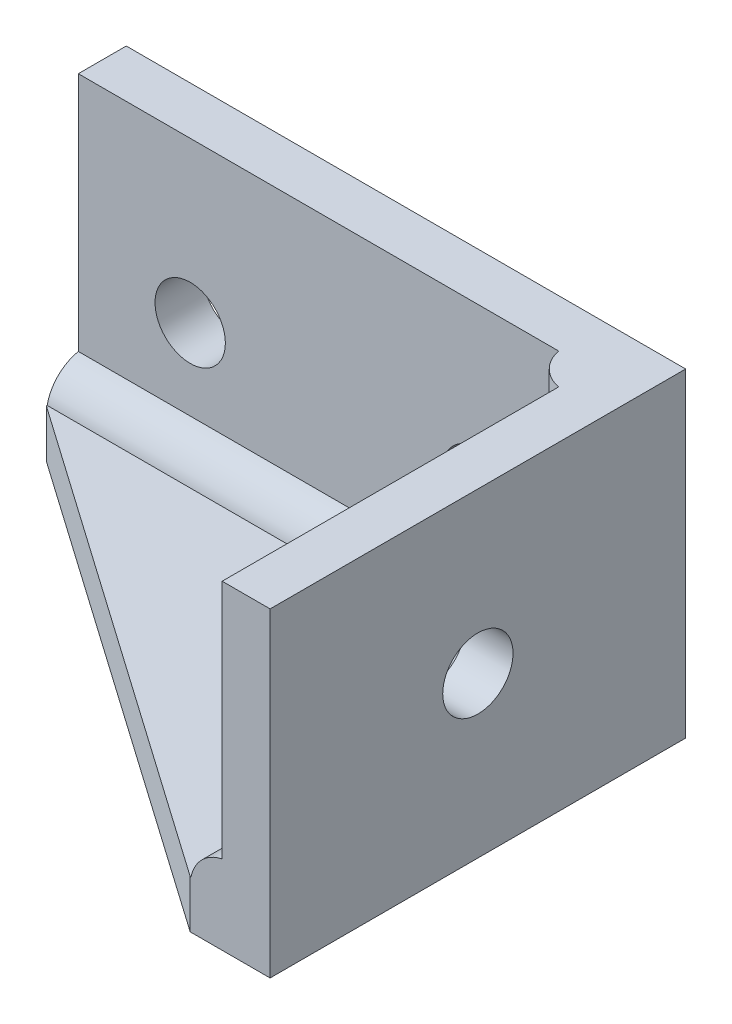
ISO-10303-21;
HEADER;
FILE_DESCRIPTION(('STEP AP214'),'2;1');
FILE_NAME('part.step','',(''),(''),'','','');
FILE_SCHEMA(('AUTOMOTIVE_DESIGN { 1 0 10303 214 1 1 1 1 }'));
ENDSEC;
DATA;
#1=APPLICATION_CONTEXT('core data for automotive mechanical design processes');
#2=APPLICATION_PROTOCOL_DEFINITION('international standard','automotive_design',2000,#1);
#3=PRODUCT_CONTEXT('',#1,'mechanical');
#4=PRODUCT('Part','Part','',(#3));
#5=PRODUCT_RELATED_PRODUCT_CATEGORY('part','',(#4));
#6=PRODUCT_DEFINITION_FORMATION('','',#4);
#7=PRODUCT_DEFINITION_CONTEXT('part definition',#1,'design');
#8=PRODUCT_DEFINITION('design','',#6,#7);
#9=PRODUCT_DEFINITION_SHAPE('','',#8);
#10=(LENGTH_UNIT() NAMED_UNIT(*) SI_UNIT(.MILLI.,.METRE.));
#11=(NAMED_UNIT(*) PLANE_ANGLE_UNIT() SI_UNIT($,.RADIAN.));
#12=(NAMED_UNIT(*) SI_UNIT($,.STERADIAN.) SOLID_ANGLE_UNIT());
#13=UNCERTAINTY_MEASURE_WITH_UNIT(LENGTH_MEASURE(1.E-05),#10,'distance_accuracy_value','');
#14=(GEOMETRIC_REPRESENTATION_CONTEXT(3) GLOBAL_UNCERTAINTY_ASSIGNED_CONTEXT((#13)) GLOBAL_UNIT_ASSIGNED_CONTEXT((#10,
#11,#12)) REPRESENTATION_CONTEXT('',''));
#15=CARTESIAN_POINT('',(0.,0.,0.));
#16=DIRECTION('',(0.,0.,1.));
#17=DIRECTION('',(1.,0.,0.));
#18=AXIS2_PLACEMENT_3D('',#15,#16,#17);
#19=CARTESIAN_POINT('',(0.,20.,26.));
#20=DIRECTION('',(-1.,0.,0.));
#21=DIRECTION('',(0.,0.,1.));
#22=AXIS2_PLACEMENT_3D('',#19,#20,#21);
#23=PLANE('',#22);
#24=CARTESIAN_POINT('',(0.,10.,13.));
#25=DIRECTION('',(-1.,0.,0.));
#26=DIRECTION('',(0.,0.,1.));
#27=AXIS2_PLACEMENT_3D('',#24,#25,#26);
#28=CIRCLE('',#27,2.2);
#29=CARTESIAN_POINT('',(0.,10.,15.2));
#30=VERTEX_POINT('',#29);
#31=EDGE_CURVE('E226',#30,#30,#28,.T.);
#32=ORIENTED_EDGE('',*,*,#31,.T.);
#33=EDGE_LOOP('',(#32));
#34=FACE_BOUND('',#33,.T.);
#35=DIRECTION('',(0.,-1.,0.));
#36=VECTOR('',#35,1.);
#37=CARTESIAN_POINT('',(0.,20.,26.));
#38=LINE('',#37,#36);
#39=CARTESIAN_POINT('',(0.,20.,26.));
#40=VERTEX_POINT('',#39);
#41=CARTESIAN_POINT('',(0.,0.,26.));
#42=VERTEX_POINT('',#41);
#43=EDGE_CURVE('E177',#40,#42,#38,.T.);
#44=ORIENTED_EDGE('',*,*,#43,.T.);
#45=DIRECTION('',(0.,0.,-1.));
#46=VECTOR('',#45,1.);
#47=CARTESIAN_POINT('',(0.,0.,26.));
#48=LINE('',#47,#46);
#49=CARTESIAN_POINT('',(0.,0.,0.));
#50=VERTEX_POINT('',#49);
#51=EDGE_CURVE('E164',#42,#50,#48,.T.);
#52=ORIENTED_EDGE('',*,*,#51,.T.);
#53=DIRECTION('',(0.,-1.,0.));
#54=VECTOR('',#53,1.);
#55=CARTESIAN_POINT('',(0.,20.,0.));
#56=LINE('',#55,#54);
#57=CARTESIAN_POINT('',(0.,20.,0.));
#58=VERTEX_POINT('',#57);
#59=EDGE_CURVE('E198',#58,#50,#56,.T.);
#60=ORIENTED_EDGE('',*,*,#59,.F.);
#61=DIRECTION('',(0.,0.,-1.));
#62=VECTOR('',#61,1.);
#63=CARTESIAN_POINT('',(0.,20.,26.));
#64=LINE('',#63,#62);
#65=EDGE_CURVE('E166',#40,#58,#64,.T.);
#66=ORIENTED_EDGE('',*,*,#65,.F.);
#67=EDGE_LOOP('',(#44,#52,#60,#66));
#68=FACE_BOUND('',#67,.T.);
#69=ADVANCED_FACE('F32',(#34,#68),#23,.F.);
#70=CARTESIAN_POINT('',(0.,20.,0.));
#71=DIRECTION('',(0.,0.,1.));
#72=DIRECTION('',(1.,0.,0.));
#73=AXIS2_PLACEMENT_3D('',#70,#71,#72);
#74=PLANE('',#73);
#75=CARTESIAN_POINT('',(-10.,10.,0.));
#76=DIRECTION('',(0.,0.,1.));
#77=DIRECTION('',(1.,0.,0.));
#78=AXIS2_PLACEMENT_3D('',#75,#76,#77);
#79=CIRCLE('',#78,2.2);
#80=CARTESIAN_POINT('',(-7.80000000000001,10.,0.));
#81=VERTEX_POINT('',#80);
#82=EDGE_CURVE('E221',#81,#81,#79,.T.);
#83=ORIENTED_EDGE('',*,*,#82,.T.);
#84=EDGE_LOOP('',(#83));
#85=FACE_BOUND('',#84,.T.);
#86=CARTESIAN_POINT('',(-28.,10.,0.));
#87=DIRECTION('',(0.,0.,1.));
#88=DIRECTION('',(1.,0.,0.));
#89=AXIS2_PLACEMENT_3D('',#86,#87,#88);
#90=CIRCLE('',#89,2.2);
#91=CARTESIAN_POINT('',(-25.8,10.,0.));
#92=VERTEX_POINT('',#91);
#93=EDGE_CURVE('E214',#92,#92,#90,.T.);
#94=ORIENTED_EDGE('',*,*,#93,.T.);
#95=EDGE_LOOP('',(#94));
#96=FACE_BOUND('',#95,.T.);
#97=DIRECTION('',(-1.,0.,0.));
#98=VECTOR('',#97,1.);
#99=CARTESIAN_POINT('',(0.,0.,0.));
#100=LINE('',#99,#98);
#101=CARTESIAN_POINT('',(-35.,0.,0.));
#102=VERTEX_POINT('',#101);
#103=EDGE_CURVE('E180',#50,#102,#100,.T.);
#104=ORIENTED_EDGE('',*,*,#103,.T.);
#105=DIRECTION('',(0.,-1.,0.));
#106=VECTOR('',#105,1.);
#107=CARTESIAN_POINT('',(-35.,20.,0.));
#108=LINE('',#107,#106);
#109=CARTESIAN_POINT('',(-35.,20.,0.));
#110=VERTEX_POINT('',#109);
#111=EDGE_CURVE('E196',#110,#102,#108,.T.);
#112=ORIENTED_EDGE('',*,*,#111,.F.);
#113=DIRECTION('',(-1.,0.,0.));
#114=VECTOR('',#113,1.);
#115=CARTESIAN_POINT('',(0.,20.,0.));
#116=LINE('',#115,#114);
#117=EDGE_CURVE('E169',#58,#110,#116,.T.);
#118=ORIENTED_EDGE('',*,*,#117,.F.);
#119=ORIENTED_EDGE('',*,*,#59,.T.);
#120=EDGE_LOOP('',(#104,#112,#118,#119));
#121=FACE_BOUND('',#120,.T.);
#122=ADVANCED_FACE('F257',(#85,#96,#121),#74,.F.);
#123=CARTESIAN_POINT('',(-35.,20.,0.));
#124=DIRECTION('',(1.,0.,0.));
#125=DIRECTION('',(0.,0.,-1.));
#126=AXIS2_PLACEMENT_3D('',#123,#124,#125);
#127=PLANE('',#126);
#128=DIRECTION('',(0.,0.,1.));
#129=VECTOR('',#128,1.);
#130=CARTESIAN_POINT('',(-35.,0.,0.));
#131=LINE('',#130,#129);
#132=CARTESIAN_POINT('',(-35.,0.,5.));
#133=VERTEX_POINT('',#132);
#134=EDGE_CURVE('E183',#102,#133,#131,.T.);
#135=ORIENTED_EDGE('',*,*,#134,.T.);
#136=DIRECTION('',(0.,-1.,0.));
#137=VECTOR('',#136,1.);
#138=CARTESIAN_POINT('',(-35.,20.,5.));
#139=LINE('',#138,#137);
#140=CARTESIAN_POINT('',(-35.,3.,5.));
#141=VERTEX_POINT('',#140);
#142=EDGE_CURVE('E194',#141,#133,#139,.T.);
#143=ORIENTED_EDGE('',*,*,#142,.F.);
#144=DIRECTION('',(0.,0.,1.));
#145=VECTOR('',#144,1.);
#146=CARTESIAN_POINT('',(-35.,3.,5.));
#147=LINE('',#146,#145);
#148=CARTESIAN_POINT('',(-35.,3.,4.94948974278318));
#149=VERTEX_POINT('',#148);
#150=EDGE_CURVE('E150',#149,#141,#147,.T.);
#151=ORIENTED_EDGE('',*,*,#150,.F.);
#152=CARTESIAN_POINT('',(-35.,2.5,2.5));
#153=DIRECTION('',(-1.,0.,0.));
#154=DIRECTION('',(0.,0.,1.));
#155=AXIS2_PLACEMENT_3D('',#152,#153,#154);
#156=CIRCLE('',#155,2.5);
#157=CARTESIAN_POINT('',(-35.,4.94948974278318,3.));
#158=VERTEX_POINT('',#157);
#159=EDGE_CURVE('E133',#149,#158,#156,.T.);
#160=ORIENTED_EDGE('',*,*,#159,.T.);
#161=DIRECTION('',(0.,1.,0.));
#162=VECTOR('',#161,1.);
#163=CARTESIAN_POINT('',(-35.,3.,3.));
#164=LINE('',#163,#162);
#165=CARTESIAN_POINT('',(-35.,20.,3.));
#166=VERTEX_POINT('',#165);
#167=EDGE_CURVE('E161',#158,#166,#164,.T.);
#168=ORIENTED_EDGE('',*,*,#167,.T.);
#169=DIRECTION('',(0.,0.,1.));
#170=VECTOR('',#169,1.);
#171=CARTESIAN_POINT('',(-35.,20.,0.));
#172=LINE('',#171,#170);
#173=EDGE_CURVE('E172',#110,#166,#172,.T.);
#174=ORIENTED_EDGE('',*,*,#173,.F.);
#175=ORIENTED_EDGE('',*,*,#111,.T.);
#176=EDGE_LOOP('',(#135,#143,#151,#160,#168,#174,#175));
#177=FACE_BOUND('',#176,.T.);
#178=ADVANCED_FACE('F261',(#177),#127,.F.);
#179=CARTESIAN_POINT('',(-35.,20.,5.));
#180=DIRECTION('',(0.573462344363328,0.,-0.819231920519041));
#181=DIRECTION('',(-0.819231920519041,0.,-0.573462344363328));
#182=AXIS2_PLACEMENT_3D('',#179,#180,#181);
#183=PLANE('',#182);
#184=DIRECTION('',(0.,-1.,0.));
#185=VECTOR('',#184,1.);
#186=CARTESIAN_POINT('',(-5.,20.,26.));
#187=LINE('',#186,#185);
#188=CARTESIAN_POINT('',(-5.,3.,26.));
#189=VERTEX_POINT('',#188);
#190=CARTESIAN_POINT('',(-5.,0.,26.));
#191=VERTEX_POINT('',#190);
#192=EDGE_CURVE('E192',#189,#191,#187,.T.);
#193=ORIENTED_EDGE('',*,*,#192,.F.);
#194=DIRECTION('',(0.81923192051904,0.,0.573462344363328));
#195=VECTOR('',#194,1.);
#196=CARTESIAN_POINT('',(-5.,3.,26.));
#197=LINE('',#196,#195);
#198=EDGE_CURVE('E152',#141,#189,#197,.T.);
#199=ORIENTED_EDGE('',*,*,#198,.F.);
#200=ORIENTED_EDGE('',*,*,#142,.T.);
#201=DIRECTION('',(0.81923192051904,0.,0.573462344363328));
#202=VECTOR('',#201,1.);
#203=CARTESIAN_POINT('',(-35.,0.,5.));
#204=LINE('',#203,#202);
#205=EDGE_CURVE('E186',#133,#191,#204,.T.);
#206=ORIENTED_EDGE('',*,*,#205,.T.);
#207=EDGE_LOOP('',(#193,#199,#200,#206));
#208=FACE_BOUND('',#207,.T.);
#209=ADVANCED_FACE('F266',(#208),#183,.F.);
#210=CARTESIAN_POINT('',(-5.,20.,26.));
#211=DIRECTION('',(0.,0.,-1.));
#212=DIRECTION('',(-1.,0.,0.));
#213=AXIS2_PLACEMENT_3D('',#210,#211,#212);
#214=PLANE('',#213);
#215=DIRECTION('',(1.,0.,0.));
#216=VECTOR('',#215,1.);
#217=CARTESIAN_POINT('',(-5.,0.,26.));
#218=LINE('',#217,#216);
#219=EDGE_CURVE('E170',#191,#42,#218,.T.);
#220=ORIENTED_EDGE('',*,*,#219,.T.);
#221=ORIENTED_EDGE('',*,*,#43,.F.);
#222=DIRECTION('',(1.,0.,0.));
#223=VECTOR('',#222,1.);
#224=CARTESIAN_POINT('',(-5.,20.,26.));
#225=LINE('',#224,#223);
#226=CARTESIAN_POINT('',(-3.,20.,26.));
#227=VERTEX_POINT('',#226);
#228=EDGE_CURVE('E175',#227,#40,#225,.T.);
#229=ORIENTED_EDGE('',*,*,#228,.F.);
#230=DIRECTION('',(0.,1.,0.));
#231=VECTOR('',#230,1.);
#232=CARTESIAN_POINT('',(-3.,3.,26.));
#233=LINE('',#232,#231);
#234=CARTESIAN_POINT('',(-3.,4.94948974278318,26.));
#235=VERTEX_POINT('',#234);
#236=EDGE_CURVE('E158',#235,#227,#233,.T.);
#237=ORIENTED_EDGE('',*,*,#236,.F.);
#238=CARTESIAN_POINT('',(-2.5,2.5,26.));
#239=DIRECTION('',(0.,0.,1.));
#240=DIRECTION('',(1.,0.,0.));
#241=AXIS2_PLACEMENT_3D('',#238,#239,#240);
#242=CIRCLE('',#241,2.5);
#243=CARTESIAN_POINT('',(-4.94948974278318,3.,26.));
#244=VERTEX_POINT('',#243);
#245=EDGE_CURVE('E146',#235,#244,#242,.T.);
#246=ORIENTED_EDGE('',*,*,#245,.T.);
#247=DIRECTION('',(1.,0.,0.));
#248=VECTOR('',#247,1.);
#249=CARTESIAN_POINT('',(-3.,3.,26.));
#250=LINE('',#249,#248);
#251=EDGE_CURVE('E155',#189,#244,#250,.T.);
#252=ORIENTED_EDGE('',*,*,#251,.F.);
#253=ORIENTED_EDGE('',*,*,#192,.T.);
#254=EDGE_LOOP('',(#220,#221,#229,#237,#246,#252,#253));
#255=FACE_BOUND('',#254,.T.);
#256=ADVANCED_FACE('F206',(#255),#214,.F.);
#257=CARTESIAN_POINT('',(0.,20.,0.));
#258=DIRECTION('',(0.,1.,0.));
#259=DIRECTION('',(0.,0.,1.));
#260=AXIS2_PLACEMENT_3D('',#257,#258,#259);
#261=PLANE('',#260);
#262=DIRECTION('',(-1.,0.,0.));
#263=VECTOR('',#262,1.);
#264=CARTESIAN_POINT('',(-35.,20.,3.));
#265=LINE('',#264,#263);
#266=CARTESIAN_POINT('',(-4.94948974278318,20.,3.));
#267=VERTEX_POINT('',#266);
#268=EDGE_CURVE('E153',#267,#166,#265,.T.);
#269=ORIENTED_EDGE('',*,*,#268,.F.);
#270=CARTESIAN_POINT('',(-2.5,20.,2.5));
#271=DIRECTION('',(0.,1.,0.));
#272=DIRECTION('',(0.,0.,1.));
#273=AXIS2_PLACEMENT_3D('',#270,#271,#272);
#274=CIRCLE('',#273,2.5);
#275=CARTESIAN_POINT('',(-3.,20.,4.94948974278318));
#276=VERTEX_POINT('',#275);
#277=EDGE_CURVE('E138',#267,#276,#274,.T.);
#278=ORIENTED_EDGE('',*,*,#277,.T.);
#279=DIRECTION('',(0.,0.,-1.));
#280=VECTOR('',#279,1.);
#281=CARTESIAN_POINT('',(-3.,20.,3.));
#282=LINE('',#281,#280);
#283=EDGE_CURVE('E54',#227,#276,#282,.T.);
#284=ORIENTED_EDGE('',*,*,#283,.F.);
#285=ORIENTED_EDGE('',*,*,#228,.T.);
#286=ORIENTED_EDGE('',*,*,#65,.T.);
#287=ORIENTED_EDGE('',*,*,#117,.T.);
#288=ORIENTED_EDGE('',*,*,#173,.T.);
#289=EDGE_LOOP('',(#269,#278,#284,#285,#286,#287,#288));
#290=FACE_BOUND('',#289,.T.);
#291=ADVANCED_FACE('F213',(#290),#261,.T.);
#292=CARTESIAN_POINT('',(0.,0.,0.));
#293=DIRECTION('',(0.,1.,0.));
#294=DIRECTION('',(0.,0.,1.));
#295=AXIS2_PLACEMENT_3D('',#292,#293,#294);
#296=PLANE('',#295);
#297=ORIENTED_EDGE('',*,*,#205,.F.);
#298=ORIENTED_EDGE('',*,*,#134,.F.);
#299=ORIENTED_EDGE('',*,*,#103,.F.);
#300=ORIENTED_EDGE('',*,*,#51,.F.);
#301=ORIENTED_EDGE('',*,*,#219,.F.);
#302=EDGE_LOOP('',(#297,#298,#299,#300,#301));
#303=FACE_BOUND('',#302,.T.);
#304=ADVANCED_FACE('F252',(#303),#296,.F.);
#305=CARTESIAN_POINT('',(-35.,3.,3.));
#306=DIRECTION('',(0.,0.,-1.));
#307=DIRECTION('',(-1.,0.,0.));
#308=AXIS2_PLACEMENT_3D('',#305,#306,#307);
#309=PLANE('',#308);
#310=CARTESIAN_POINT('',(-10.,10.,3.));
#311=DIRECTION('',(0.,0.,1.));
#312=DIRECTION('',(1.,0.,0.));
#313=AXIS2_PLACEMENT_3D('',#310,#311,#312);
#314=CIRCLE('',#313,2.2);
#315=CARTESIAN_POINT('',(-7.80000000000001,10.,3.));
#316=VERTEX_POINT('',#315);
#317=EDGE_CURVE('E223',#316,#316,#314,.T.);
#318=ORIENTED_EDGE('',*,*,#317,.F.);
#319=EDGE_LOOP('',(#318));
#320=FACE_BOUND('',#319,.T.);
#321=CARTESIAN_POINT('',(-28.,10.,3.));
#322=DIRECTION('',(0.,0.,1.));
#323=DIRECTION('',(1.,0.,0.));
#324=AXIS2_PLACEMENT_3D('',#321,#322,#323);
#325=CIRCLE('',#324,2.2);
#326=CARTESIAN_POINT('',(-25.8,10.,3.));
#327=VERTEX_POINT('',#326);
#328=EDGE_CURVE('E216',#327,#327,#325,.T.);
#329=ORIENTED_EDGE('',*,*,#328,.F.);
#330=EDGE_LOOP('',(#329));
#331=FACE_BOUND('',#330,.T.);
#332=DIRECTION('',(-1.,0.,0.));
#333=VECTOR('',#332,1.);
#334=CARTESIAN_POINT('',(4.07106781186548,4.94948974278318,3.));
#335=LINE('',#334,#333);
#336=CARTESIAN_POINT('',(-4.94948974278432,4.94948974278318,3.));
#337=VERTEX_POINT('',#336);
#338=EDGE_CURVE('E144',#158,#337,#335,.F.);
#339=ORIENTED_EDGE('',*,*,#338,.T.);
#340=DIRECTION('',(0.,1.,0.));
#341=VECTOR('',#340,1.);
#342=CARTESIAN_POINT('',(-4.94948974278318,-500000.,3.));
#343=LINE('',#342,#341);
#344=EDGE_CURVE('E46',#267,#337,#343,.F.);
#345=ORIENTED_EDGE('',*,*,#344,.F.);
#346=ORIENTED_EDGE('',*,*,#268,.T.);
#347=ORIENTED_EDGE('',*,*,#167,.F.);
#348=EDGE_LOOP('',(#339,#345,#346,#347));
#349=FACE_BOUND('',#348,.T.);
#350=ADVANCED_FACE('F245',(#320,#331,#349),#309,.F.);
#351=CARTESIAN_POINT('',(-3.,3.,3.));
#352=DIRECTION('',(1.,0.,0.));
#353=DIRECTION('',(0.,0.,-1.));
#354=AXIS2_PLACEMENT_3D('',#351,#352,#353);
#355=PLANE('',#354);
#356=CARTESIAN_POINT('',(-3.,10.,13.));
#357=DIRECTION('',(-1.,0.,0.));
#358=DIRECTION('',(0.,0.,1.));
#359=AXIS2_PLACEMENT_3D('',#356,#357,#358);
#360=CIRCLE('',#359,2.2);
#361=CARTESIAN_POINT('',(-3.,10.,15.2));
#362=VERTEX_POINT('',#361);
#363=EDGE_CURVE('E229',#362,#362,#360,.T.);
#364=ORIENTED_EDGE('',*,*,#363,.F.);
#365=EDGE_LOOP('',(#364));
#366=FACE_BOUND('',#365,.T.);
#367=ORIENTED_EDGE('',*,*,#283,.T.);
#368=DIRECTION('',(0.,1.,0.));
#369=VECTOR('',#368,1.);
#370=CARTESIAN_POINT('',(-3.,-500000.,4.94948974278318));
#371=LINE('',#370,#369);
#372=CARTESIAN_POINT('',(-3.,4.94948974278318,4.94948974278431));
#373=VERTEX_POINT('',#372);
#374=EDGE_CURVE('E129',#373,#276,#371,.T.);
#375=ORIENTED_EDGE('',*,*,#374,.F.);
#376=DIRECTION('',(0.,0.,1.));
#377=VECTOR('',#376,1.);
#378=CARTESIAN_POINT('',(-3.,4.94948974278318,-4.07106781186548));
#379=LINE('',#378,#377);
#380=EDGE_CURVE('E127',#373,#235,#379,.T.);
#381=ORIENTED_EDGE('',*,*,#380,.T.);
#382=ORIENTED_EDGE('',*,*,#236,.T.);
#383=EDGE_LOOP('',(#367,#375,#381,#382));
#384=FACE_BOUND('',#383,.T.);
#385=ADVANCED_FACE('F210',(#366,#384),#355,.F.);
#386=CARTESIAN_POINT('',(0.,3.,0.));
#387=DIRECTION('',(0.,-1.,0.));
#388=DIRECTION('',(0.,0.,-1.));
#389=AXIS2_PLACEMENT_3D('',#386,#387,#388);
#390=PLANE('',#389);
#391=DIRECTION('',(0.,0.,1.));
#392=VECTOR('',#391,1.);
#393=CARTESIAN_POINT('',(-4.94948974278318,3.,-4.07106781186548));
#394=LINE('',#393,#392);
#395=CARTESIAN_POINT('',(-4.94948974278318,3.,4.94948974278318));
#396=VERTEX_POINT('',#395);
#397=EDGE_CURVE('E39',#244,#396,#394,.F.);
#398=ORIENTED_EDGE('',*,*,#397,.T.);
#399=DIRECTION('',(-1.,0.,0.));
#400=VECTOR('',#399,1.);
#401=CARTESIAN_POINT('',(4.07106781186548,3.,4.94948974278318));
#402=LINE('',#401,#400);
#403=EDGE_CURVE('E119',#396,#149,#402,.T.);
#404=ORIENTED_EDGE('',*,*,#403,.T.);
#405=ORIENTED_EDGE('',*,*,#150,.T.);
#406=ORIENTED_EDGE('',*,*,#198,.T.);
#407=ORIENTED_EDGE('',*,*,#251,.T.);
#408=EDGE_LOOP('',(#398,#404,#405,#406,#407));
#409=FACE_BOUND('',#408,.T.);
#410=ADVANCED_FACE('F201',(#409),#390,.F.);
#411=CARTESIAN_POINT('',(-2.5,2.5,-4.07106781186548));
#412=DIRECTION('',(0.,0.,1.));
#413=DIRECTION('',(1.,0.,0.));
#414=AXIS2_PLACEMENT_3D('',#411,#412,#413);
#415=CYLINDRICAL_SURFACE('',#414,2.5);
#416=CARTESIAN_POINT('',(-2.5,2.49999999999886,2.5));
#417=DIRECTION('',(0.,0.707106781186547,-0.707106781186547));
#418=DIRECTION('',(0.,0.707106781186547,0.707106781186547));
#419=AXIS2_PLACEMENT_3D('',#416,#417,#418);
#420=ELLIPSE('',#419,3.53553390593274,2.5);
#421=CARTESIAN_POINT('',(-4.26776695296665,4.26776695296552,4.26776695296665));
#422=VERTEX_POINT('',#421);
#423=EDGE_CURVE('E124',#373,#422,#420,.F.);
#424=ORIENTED_EDGE('',*,*,#423,.T.);
#425=CARTESIAN_POINT('',(-2.5,2.5,2.5));
#426=DIRECTION('',(0.707106781186547,0.,0.707106781186547));
#427=DIRECTION('',(-0.707106781186547,0.,0.707106781186547));
#428=AXIS2_PLACEMENT_3D('',#425,#426,#427);
#429=ELLIPSE('',#428,3.53553390593274,2.5);
#430=EDGE_CURVE('E11',#396,#422,#429,.F.);
#431=ORIENTED_EDGE('',*,*,#430,.F.);
#432=ORIENTED_EDGE('',*,*,#397,.F.);
#433=ORIENTED_EDGE('',*,*,#245,.F.);
#434=ORIENTED_EDGE('',*,*,#380,.F.);
#435=EDGE_LOOP('',(#424,#431,#432,#433,#434));
#436=FACE_BOUND('',#435,.T.);
#437=ADVANCED_FACE('F125',(#436),#415,.T.);
#438=CARTESIAN_POINT('',(4.07106781186548,2.5,2.5));
#439=DIRECTION('',(-1.,0.,0.));
#440=DIRECTION('',(0.,0.,1.));
#441=AXIS2_PLACEMENT_3D('',#438,#439,#440);
#442=CYLINDRICAL_SURFACE('',#441,2.5);
#443=CARTESIAN_POINT('',(-2.5,2.49999999999886,2.5));
#444=DIRECTION('',(0.707106781186547,0.707106781186547,0.));
#445=DIRECTION('',(-0.707106781186547,0.707106781186547,0.));
#446=AXIS2_PLACEMENT_3D('',#443,#444,#445);
#447=ELLIPSE('',#446,3.53553390593274,2.5);
#448=EDGE_CURVE('E117',#422,#337,#447,.F.);
#449=ORIENTED_EDGE('',*,*,#448,.T.);
#450=ORIENTED_EDGE('',*,*,#338,.F.);
#451=ORIENTED_EDGE('',*,*,#159,.F.);
#452=ORIENTED_EDGE('',*,*,#403,.F.);
#453=ORIENTED_EDGE('',*,*,#430,.T.);
#454=EDGE_LOOP('',(#449,#450,#451,#452,#453));
#455=FACE_BOUND('',#454,.T.);
#456=ADVANCED_FACE('F114',(#455),#442,.T.);
#457=CARTESIAN_POINT('',(-2.5,-500000.,2.5));
#458=DIRECTION('',(0.,1.,0.));
#459=DIRECTION('',(0.,0.,1.));
#460=AXIS2_PLACEMENT_3D('',#457,#458,#459);
#461=CYLINDRICAL_SURFACE('',#460,2.5);
#462=ORIENTED_EDGE('',*,*,#423,.F.);
#463=ORIENTED_EDGE('',*,*,#374,.T.);
#464=ORIENTED_EDGE('',*,*,#277,.F.);
#465=ORIENTED_EDGE('',*,*,#344,.T.);
#466=ORIENTED_EDGE('',*,*,#448,.F.);
#467=EDGE_LOOP('',(#462,#463,#464,#465,#466));
#468=FACE_BOUND('',#467,.T.);
#469=ADVANCED_FACE('F131',(#468),#461,.T.);
#470=CARTESIAN_POINT('',(-28.,10.,0.));
#471=DIRECTION('',(0.,0.,1.));
#472=DIRECTION('',(1.,0.,0.));
#473=AXIS2_PLACEMENT_3D('',#470,#471,#472);
#474=CYLINDRICAL_SURFACE('',#473,2.2);
#475=ORIENTED_EDGE('',*,*,#93,.F.);
#476=EDGE_LOOP('',(#475));
#477=FACE_BOUND('',#476,.T.);
#478=ORIENTED_EDGE('',*,*,#328,.T.);
#479=EDGE_LOOP('',(#478));
#480=FACE_BOUND('',#479,.T.);
#481=ADVANCED_FACE('F302',(#477,#480),#474,.F.);
#482=CARTESIAN_POINT('',(-10.,10.,0.));
#483=DIRECTION('',(0.,0.,1.));
#484=DIRECTION('',(1.,0.,0.));
#485=AXIS2_PLACEMENT_3D('',#482,#483,#484);
#486=CYLINDRICAL_SURFACE('',#485,2.2);
#487=ORIENTED_EDGE('',*,*,#82,.F.);
#488=EDGE_LOOP('',(#487));
#489=FACE_BOUND('',#488,.T.);
#490=ORIENTED_EDGE('',*,*,#317,.T.);
#491=EDGE_LOOP('',(#490));
#492=FACE_BOUND('',#491,.T.);
#493=ADVANCED_FACE('F240',(#489,#492),#486,.F.);
#494=CARTESIAN_POINT('',(0.,10.,13.));
#495=DIRECTION('',(-1.,0.,0.));
#496=DIRECTION('',(0.,0.,1.));
#497=AXIS2_PLACEMENT_3D('',#494,#495,#496);
#498=CYLINDRICAL_SURFACE('',#497,2.2);
#499=CARTESIAN_POINT('',(0.,10.,15.2));
#500=CARTESIAN_POINT('',(-0.0312499999999965,10.,15.2));
#501=CARTESIAN_POINT('',(-0.0624999999999965,10.,15.2));
#502=CARTESIAN_POINT('',(-0.124999999999997,10.,15.2));
#503=CARTESIAN_POINT('',(-0.156249999999997,10.,15.2));
#504=CARTESIAN_POINT('',(-0.218749999999997,10.,15.2));
#505=CARTESIAN_POINT('',(-0.249999999999997,10.,15.2));
#506=CARTESIAN_POINT('',(-0.312499999999997,10.,15.2));
#507=CARTESIAN_POINT('',(-0.343749999999997,10.,15.2));
#508=CARTESIAN_POINT('',(-0.406249999999997,10.,15.2));
#509=CARTESIAN_POINT('',(-0.437499999999997,10.,15.2));
#510=CARTESIAN_POINT('',(-0.499999999999997,10.,15.2));
#511=CARTESIAN_POINT('',(-0.531249999999997,10.,15.2));
#512=CARTESIAN_POINT('',(-0.593749999999997,10.,15.2));
#513=CARTESIAN_POINT('',(-0.624999999999997,10.,15.2));
#514=CARTESIAN_POINT('',(-0.687499999999997,10.,15.2));
#515=CARTESIAN_POINT('',(-0.718749999999997,10.,15.2));
#516=CARTESIAN_POINT('',(-0.781249999999997,10.,15.2));
#517=CARTESIAN_POINT('',(-0.812499999999997,10.,15.2));
#518=CARTESIAN_POINT('',(-0.874999999999997,10.,15.2));
#519=CARTESIAN_POINT('',(-0.906249999999997,10.,15.2));
#520=CARTESIAN_POINT('',(-0.968749999999997,10.,15.2));
#521=CARTESIAN_POINT('',(-0.999999999999997,10.,15.2));
#522=CARTESIAN_POINT('',(-1.0625,10.,15.2));
#523=CARTESIAN_POINT('',(-1.09375,10.,15.2));
#524=CARTESIAN_POINT('',(-1.15625,10.,15.2));
#525=CARTESIAN_POINT('',(-1.1875,10.,15.2));
#526=CARTESIAN_POINT('',(-1.25,10.,15.2));
#527=CARTESIAN_POINT('',(-1.28125,10.,15.2));
#528=CARTESIAN_POINT('',(-1.34375,10.,15.2));
#529=CARTESIAN_POINT('',(-1.375,10.,15.2));
#530=CARTESIAN_POINT('',(-1.4375,10.,15.2));
#531=CARTESIAN_POINT('',(-1.46875,10.,15.2));
#532=CARTESIAN_POINT('',(-1.53125,10.,15.2));
#533=CARTESIAN_POINT('',(-1.5625,10.,15.2));
#534=CARTESIAN_POINT('',(-1.625,10.,15.2));
#535=CARTESIAN_POINT('',(-1.65625,10.,15.2));
#536=CARTESIAN_POINT('',(-1.71875,10.,15.2));
#537=CARTESIAN_POINT('',(-1.75,10.,15.2));
#538=CARTESIAN_POINT('',(-1.8125,10.,15.2));
#539=CARTESIAN_POINT('',(-1.84375,10.,15.2));
#540=CARTESIAN_POINT('',(-1.90625,10.,15.2));
#541=CARTESIAN_POINT('',(-1.9375,10.,15.2));
#542=CARTESIAN_POINT('',(-2.,10.,15.2));
#543=CARTESIAN_POINT('',(-2.03125,10.,15.2));
#544=CARTESIAN_POINT('',(-2.09375,10.,15.2));
#545=CARTESIAN_POINT('',(-2.125,10.,15.2));
#546=CARTESIAN_POINT('',(-2.1875,10.,15.2));
#547=CARTESIAN_POINT('',(-2.21875,10.,15.2));
#548=CARTESIAN_POINT('',(-2.28125,10.,15.2));
#549=CARTESIAN_POINT('',(-2.3125,10.,15.2));
#550=CARTESIAN_POINT('',(-2.375,10.,15.2));
#551=CARTESIAN_POINT('',(-2.40625,10.,15.2));
#552=CARTESIAN_POINT('',(-2.46875,10.,15.2));
#553=CARTESIAN_POINT('',(-2.5,10.,15.2));
#554=CARTESIAN_POINT('',(-2.5625,10.,15.2));
#555=CARTESIAN_POINT('',(-2.59375,10.,15.2));
#556=CARTESIAN_POINT('',(-2.65625,10.,15.2));
#557=CARTESIAN_POINT('',(-2.6875,10.,15.2));
#558=CARTESIAN_POINT('',(-2.75,10.,15.2));
#559=CARTESIAN_POINT('',(-2.78125,10.,15.2));
#560=CARTESIAN_POINT('',(-2.84375,10.,15.2));
#561=CARTESIAN_POINT('',(-2.875,10.,15.2));
#562=CARTESIAN_POINT('',(-2.9375,10.,15.2));
#563=CARTESIAN_POINT('',(-2.96875,10.,15.2));
#564=CARTESIAN_POINT('',(-3.,10.,15.2));
#565=B_SPLINE_CURVE_WITH_KNOTS('',3,(#499,#500,#501,#502,#503,#504,#505,#506,#507,#508,#509,
#510,#511,#512,#513,#514,#515,#516,#517,#518,#519,#520,#521,#522,#523,#524,#525,#526,#527,#528,
#529,#530,#531,#532,#533,#534,#535,#536,#537,#538,#539,#540,#541,#542,#543,#544,#545,#546,#547,
#548,#549,#550,#551,#552,#553,#554,#555,#556,#557,#558,#559,#560,#561,#562,#563,#564),
.UNSPECIFIED.,.F.,.F.,(4,2,2,2,2,2,2,2,2,2,2,2,2,2,2,2,2,2,2,2,2,2,2,2,2,2,2,2,2,2,2,2,4),(0.,
0.0937500000000001,0.1875,0.28125,0.375,0.46875,0.562500000000001,0.656250000000001,
0.750000000000001,0.843750000000001,0.937500000000001,1.03125,1.125,1.21875,1.3125,1.40625,1.5,
1.59375,1.6875,1.78125,1.875,1.96875,2.0625,2.15625,2.25,2.34375,2.4375,2.53125,2.625,2.71875,
2.8125,2.90625,3.),.UNSPECIFIED.);
#566=EDGE_CURVE('BSEAM237',#30,#362,#565,.T.);
#567=ORIENTED_EDGE('',*,*,#31,.F.);
#568=ORIENTED_EDGE('',*,*,#363,.T.);
#569=ORIENTED_EDGE('',*,*,#566,.T.);
#570=ORIENTED_EDGE('',*,*,#566,.F.);
#571=EDGE_LOOP('',(#567,#569,#568,#570));
#572=FACE_BOUND('',#571,.T.);
#573=ADVANCED_FACE('F237',(#572),#498,.F.);
#574=CLOSED_SHELL('',(#69,#122,#178,#209,#256,#291,#304,#350,#385,#410,#437,#456,#469,#481,#493,#573));
#575=MANIFOLD_SOLID_BREP('B2',#574);
#576=ADVANCED_BREP_SHAPE_REPRESENTATION('',(#18,#575),#14);
#577=SHAPE_DEFINITION_REPRESENTATION(#9,#576);
ENDSEC;
END-ISO-10303-21;
